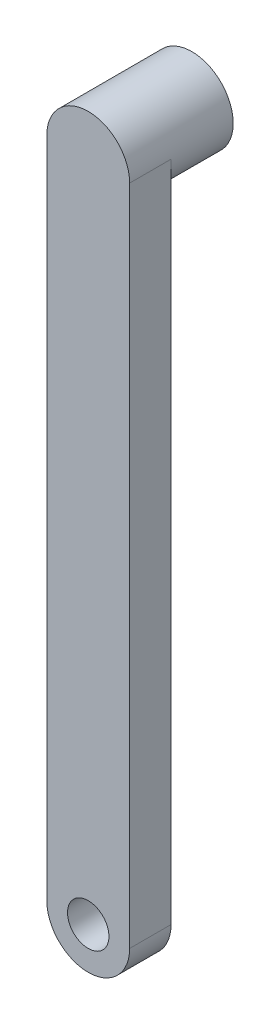
ISO-10303-21;
HEADER;
FILE_DESCRIPTION(('STEP AP214'),'2;1');
FILE_NAME('part.step','',(''),(''),'','','');
FILE_SCHEMA(('AUTOMOTIVE_DESIGN { 1 0 10303 214 1 1 1 1 }'));
ENDSEC;
DATA;
#1=APPLICATION_CONTEXT('core data for automotive mechanical design processes');
#2=APPLICATION_PROTOCOL_DEFINITION('international standard','automotive_design',2000,#1);
#3=PRODUCT_CONTEXT('',#1,'mechanical');
#4=PRODUCT('Part','Part','',(#3));
#5=PRODUCT_RELATED_PRODUCT_CATEGORY('part','',(#4));
#6=PRODUCT_DEFINITION_FORMATION('','',#4);
#7=PRODUCT_DEFINITION_CONTEXT('part definition',#1,'design');
#8=PRODUCT_DEFINITION('design','',#6,#7);
#9=PRODUCT_DEFINITION_SHAPE('','',#8);
#10=(LENGTH_UNIT() NAMED_UNIT(*) SI_UNIT(.MILLI.,.METRE.));
#11=(NAMED_UNIT(*) PLANE_ANGLE_UNIT() SI_UNIT($,.RADIAN.));
#12=(NAMED_UNIT(*) SI_UNIT($,.STERADIAN.) SOLID_ANGLE_UNIT());
#13=UNCERTAINTY_MEASURE_WITH_UNIT(LENGTH_MEASURE(1.E-05),#10,'distance_accuracy_value','');
#14=(GEOMETRIC_REPRESENTATION_CONTEXT(3) GLOBAL_UNCERTAINTY_ASSIGNED_CONTEXT((#13)) GLOBAL_UNIT_ASSIGNED_CONTEXT((#10,
#11,#12)) REPRESENTATION_CONTEXT('',''));
#15=CARTESIAN_POINT('',(0.,0.,0.));
#16=DIRECTION('',(0.,0.,1.));
#17=DIRECTION('',(1.,0.,0.));
#18=AXIS2_PLACEMENT_3D('',#15,#16,#17);
#19=CARTESIAN_POINT('',(-51.9393839224248,71.9645524720856,10.));
#20=DIRECTION('',(1.,0.,0.));
#21=DIRECTION('',(0.,1.,0.));
#22=AXIS2_PLACEMENT_3D('',#19,#20,#21);
#23=PLANE('',#22);
#24=DIRECTION('',(0.,-1.,0.));
#25=VECTOR('',#24,1.);
#26=CARTESIAN_POINT('',(-51.9393839224248,71.9645524720856,0.));
#27=LINE('',#26,#25);
#28=CARTESIAN_POINT('',(-51.9393839224248,71.9645524720856,0.));
#29=VERTEX_POINT('',#28);
#30=CARTESIAN_POINT('',(-51.9393839224247,-88.0354475279144,0.));
#31=VERTEX_POINT('',#30);
#32=EDGE_CURVE('E91',#29,#31,#27,.T.);
#33=ORIENTED_EDGE('',*,*,#32,.T.);
#34=DIRECTION('',(0.,0.,-1.));
#35=VECTOR('',#34,1.);
#36=CARTESIAN_POINT('',(-51.9393839224247,-88.0354475279144,10.));
#37=LINE('',#36,#35);
#38=CARTESIAN_POINT('',(-51.9393839224247,-88.0354475279144,10.));
#39=VERTEX_POINT('',#38);
#40=EDGE_CURVE('E103',#39,#31,#37,.T.);
#41=ORIENTED_EDGE('',*,*,#40,.F.);
#42=DIRECTION('',(0.,-1.,0.));
#43=VECTOR('',#42,1.);
#44=CARTESIAN_POINT('',(-51.9393839224248,71.9645524720856,10.));
#45=LINE('',#44,#43);
#46=CARTESIAN_POINT('',(-51.9393839224248,71.9645524720856,10.));
#47=VERTEX_POINT('',#46);
#48=EDGE_CURVE('E96',#47,#39,#45,.T.);
#49=ORIENTED_EDGE('',*,*,#48,.F.);
#50=DIRECTION('',(0.,0.,-1.));
#51=VECTOR('',#50,1.);
#52=CARTESIAN_POINT('',(-51.9393839224248,71.9645524720856,10.));
#53=LINE('',#52,#51);
#54=EDGE_CURVE('E50',#47,#29,#53,.T.);
#55=ORIENTED_EDGE('',*,*,#54,.T.);
#56=EDGE_LOOP('',(#33,#41,#49,#55));
#57=FACE_BOUND('',#56,.T.);
#58=ADVANCED_FACE('F39',(#57),#23,.F.);
#59=CARTESIAN_POINT('',(-41.9393839224247,-88.0354475279144,10.));
#60=DIRECTION('',(0.,0.,-1.));
#61=DIRECTION('',(-1.,0.,0.));
#62=AXIS2_PLACEMENT_3D('',#59,#60,#61);
#63=CYLINDRICAL_SURFACE('',#62,9.99999999999999);
#64=CARTESIAN_POINT('',(-41.9393839224247,-88.0354475279144,0.));
#65=DIRECTION('',(0.,0.,1.));
#66=DIRECTION('',(1.,0.,0.));
#67=AXIS2_PLACEMENT_3D('',#64,#65,#66);
#68=CIRCLE('',#67,9.99999999999999);
#69=CARTESIAN_POINT('',(-31.9393839224248,-88.0354475279144,0.));
#70=VERTEX_POINT('',#69);
#71=EDGE_CURVE('E69',#31,#70,#68,.T.);
#72=ORIENTED_EDGE('',*,*,#71,.T.);
#73=DIRECTION('',(0.,0.,-1.));
#74=VECTOR('',#73,1.);
#75=CARTESIAN_POINT('',(-31.9393839224248,-88.0354475279144,10.));
#76=LINE('',#75,#74);
#77=CARTESIAN_POINT('',(-31.9393839224248,-88.0354475279144,10.));
#78=VERTEX_POINT('',#77);
#79=EDGE_CURVE('E88',#78,#70,#76,.T.);
#80=ORIENTED_EDGE('',*,*,#79,.F.);
#81=CARTESIAN_POINT('',(-41.9393839224247,-88.0354475279144,10.));
#82=DIRECTION('',(0.,0.,1.));
#83=DIRECTION('',(1.,0.,0.));
#84=AXIS2_PLACEMENT_3D('',#81,#82,#83);
#85=CIRCLE('',#84,9.99999999999999);
#86=EDGE_CURVE('E54',#39,#78,#85,.T.);
#87=ORIENTED_EDGE('',*,*,#86,.F.);
#88=ORIENTED_EDGE('',*,*,#40,.T.);
#89=EDGE_LOOP('',(#72,#80,#87,#88));
#90=FACE_BOUND('',#89,.T.);
#91=ADVANCED_FACE('F128',(#90),#63,.T.);
#92=CARTESIAN_POINT('',(-31.9393839224248,-88.0354475279144,10.));
#93=DIRECTION('',(-1.,0.,0.));
#94=DIRECTION('',(0.,0.,1.));
#95=AXIS2_PLACEMENT_3D('',#92,#93,#94);
#96=PLANE('',#95);
#97=DIRECTION('',(0.,1.,0.));
#98=VECTOR('',#97,1.);
#99=CARTESIAN_POINT('',(-31.9393839224248,-88.0354475279144,0.));
#100=LINE('',#99,#98);
#101=CARTESIAN_POINT('',(-31.9393839224248,71.9645524720856,0.));
#102=VERTEX_POINT('',#101);
#103=EDGE_CURVE('E95',#70,#102,#100,.T.);
#104=ORIENTED_EDGE('',*,*,#103,.T.);
#105=DIRECTION('',(0.,0.,-1.));
#106=VECTOR('',#105,1.);
#107=CARTESIAN_POINT('',(-31.9393839224248,71.9645524720856,10.));
#108=LINE('',#107,#106);
#109=CARTESIAN_POINT('',(-31.9393839224248,71.9645524720856,10.));
#110=VERTEX_POINT('',#109);
#111=EDGE_CURVE('E73',#110,#102,#108,.T.);
#112=ORIENTED_EDGE('',*,*,#111,.F.);
#113=DIRECTION('',(0.,1.,0.));
#114=VECTOR('',#113,1.);
#115=CARTESIAN_POINT('',(-31.9393839224248,-88.0354475279144,10.));
#116=LINE('',#115,#114);
#117=EDGE_CURVE('E87',#78,#110,#116,.T.);
#118=ORIENTED_EDGE('',*,*,#117,.F.);
#119=ORIENTED_EDGE('',*,*,#79,.T.);
#120=EDGE_LOOP('',(#104,#112,#118,#119));
#121=FACE_BOUND('',#120,.T.);
#122=ADVANCED_FACE('F92',(#121),#96,.F.);
#123=CARTESIAN_POINT('',(-41.9393839224247,-88.0354475279144,10.));
#124=DIRECTION('',(0.,0.,1.));
#125=DIRECTION('',(1.,0.,0.));
#126=AXIS2_PLACEMENT_3D('',#123,#124,#125);
#127=PLANE('',#126);
#128=ORIENTED_EDGE('',*,*,#117,.T.);
#129=CARTESIAN_POINT('',(-41.9393839224248,71.9645524720856,10.));
#130=DIRECTION('',(0.,0.,1.));
#131=DIRECTION('',(1.,0.,0.));
#132=AXIS2_PLACEMENT_3D('',#129,#130,#131);
#133=CIRCLE('',#132,10.);
#134=EDGE_CURVE('E85',#110,#47,#133,.T.);
#135=ORIENTED_EDGE('',*,*,#134,.T.);
#136=ORIENTED_EDGE('',*,*,#48,.T.);
#137=ORIENTED_EDGE('',*,*,#86,.T.);
#138=EDGE_LOOP('',(#128,#135,#136,#137));
#139=FACE_BOUND('',#138,.T.);
#140=CARTESIAN_POINT('',(-41.9393839224247,-88.0354475279144,10.000012));
#141=DIRECTION('',(0.,0.,1.));
#142=DIRECTION('',(1.,0.,0.));
#143=AXIS2_PLACEMENT_3D('',#140,#141,#142);
#144=CIRCLE('',#143,5.);
#145=CARTESIAN_POINT('',(-36.9393839224247,-88.0354475279144,10.000012));
#146=VERTEX_POINT('',#145);
#147=EDGE_CURVE('E108',#146,#146,#144,.T.);
#148=ORIENTED_EDGE('',*,*,#147,.F.);
#149=EDGE_LOOP('',(#148));
#150=FACE_BOUND('',#149,.T.);
#151=ADVANCED_FACE('F114',(#139,#150),#127,.T.);
#152=CARTESIAN_POINT('',(-41.9393839224247,-88.0354475279144,0.));
#153=DIRECTION('',(0.,0.,1.));
#154=DIRECTION('',(1.,0.,0.));
#155=AXIS2_PLACEMENT_3D('',#152,#153,#154);
#156=PLANE('',#155);
#157=CARTESIAN_POINT('',(-41.9393839224247,-88.0354475279144,0.));
#158=DIRECTION('',(0.,0.,1.));
#159=DIRECTION('',(1.,0.,0.));
#160=AXIS2_PLACEMENT_3D('',#157,#158,#159);
#161=CIRCLE('',#160,5.);
#162=CARTESIAN_POINT('',(-36.9393839224247,-88.0354475279144,0.));
#163=VERTEX_POINT('',#162);
#164=EDGE_CURVE('E143',#163,#163,#161,.T.);
#165=ORIENTED_EDGE('',*,*,#164,.T.);
#166=EDGE_LOOP('',(#165));
#167=FACE_BOUND('',#166,.T.);
#168=ORIENTED_EDGE('',*,*,#32,.F.);
#169=CARTESIAN_POINT('',(-41.9393839224248,71.9645524720856,0.));
#170=DIRECTION('',(0.,0.,1.));
#171=DIRECTION('',(1.,0.,0.));
#172=AXIS2_PLACEMENT_3D('',#169,#170,#171);
#173=CIRCLE('',#172,10.);
#174=EDGE_CURVE('E11',#29,#102,#173,.T.);
#175=ORIENTED_EDGE('',*,*,#174,.T.);
#176=ORIENTED_EDGE('',*,*,#103,.F.);
#177=ORIENTED_EDGE('',*,*,#71,.F.);
#178=EDGE_LOOP('',(#168,#175,#176,#177));
#179=FACE_BOUND('',#178,.T.);
#180=ADVANCED_FACE('F93',(#167,#179),#156,.F.);
#181=CARTESIAN_POINT('',(-41.9393839224247,-88.0354475279144,0.));
#182=DIRECTION('',(0.,0.,1.));
#183=DIRECTION('',(1.,0.,0.));
#184=AXIS2_PLACEMENT_3D('',#181,#182,#183);
#185=CYLINDRICAL_SURFACE('',#184,5.);
#186=ORIENTED_EDGE('',*,*,#164,.F.);
#187=EDGE_LOOP('',(#186));
#188=FACE_BOUND('',#187,.T.);
#189=ORIENTED_EDGE('',*,*,#147,.T.);
#190=EDGE_LOOP('',(#189));
#191=FACE_BOUND('',#190,.T.);
#192=ADVANCED_FACE('F124',(#188,#191),#185,.F.);
#193=CARTESIAN_POINT('',(-41.9393839224248,71.9645524720856,-15.));
#194=DIRECTION('',(0.,0.,1.));
#195=DIRECTION('',(1.,0.,0.));
#196=AXIS2_PLACEMENT_3D('',#193,#194,#195);
#197=CYLINDRICAL_SURFACE('',#196,10.);
#198=ORIENTED_EDGE('',*,*,#174,.F.);
#199=ORIENTED_EDGE('',*,*,#54,.F.);
#200=ORIENTED_EDGE('',*,*,#134,.F.);
#201=ORIENTED_EDGE('',*,*,#111,.T.);
#202=EDGE_LOOP('',(#198,#199,#200,#201));
#203=FACE_BOUND('',#202,.T.);
#204=CARTESIAN_POINT('',(-41.9393839224248,71.9645524720856,-15.));
#205=DIRECTION('',(0.,0.,1.));
#206=DIRECTION('',(1.,0.,0.));
#207=AXIS2_PLACEMENT_3D('',#204,#205,#206);
#208=CIRCLE('',#207,10.);
#209=CARTESIAN_POINT('',(-31.9393839224248,71.9645524720856,-15.));
#210=VERTEX_POINT('',#209);
#211=EDGE_CURVE('E158',#210,#210,#208,.T.);
#212=ORIENTED_EDGE('',*,*,#211,.T.);
#213=EDGE_LOOP('',(#212));
#214=FACE_BOUND('',#213,.T.);
#215=ADVANCED_FACE('F77',(#203,#214),#197,.T.);
#216=CARTESIAN_POINT('',(-41.9393839224248,71.9645524720856,-15.));
#217=DIRECTION('',(0.,0.,1.));
#218=DIRECTION('',(1.,0.,0.));
#219=AXIS2_PLACEMENT_3D('',#216,#217,#218);
#220=PLANE('',#219);
#221=ORIENTED_EDGE('',*,*,#211,.F.);
#222=EDGE_LOOP('',(#221));
#223=FACE_BOUND('',#222,.T.);
#224=ADVANCED_FACE('F165',(#223),#220,.F.);
#225=CLOSED_SHELL('',(#58,#91,#122,#151,#180,#192,#215,#224));
#226=MANIFOLD_SOLID_BREP('B2',#225);
#227=ADVANCED_BREP_SHAPE_REPRESENTATION('',(#18,#226),#14);
#228=SHAPE_DEFINITION_REPRESENTATION(#9,#227);
ENDSEC;
END-ISO-10303-21;
